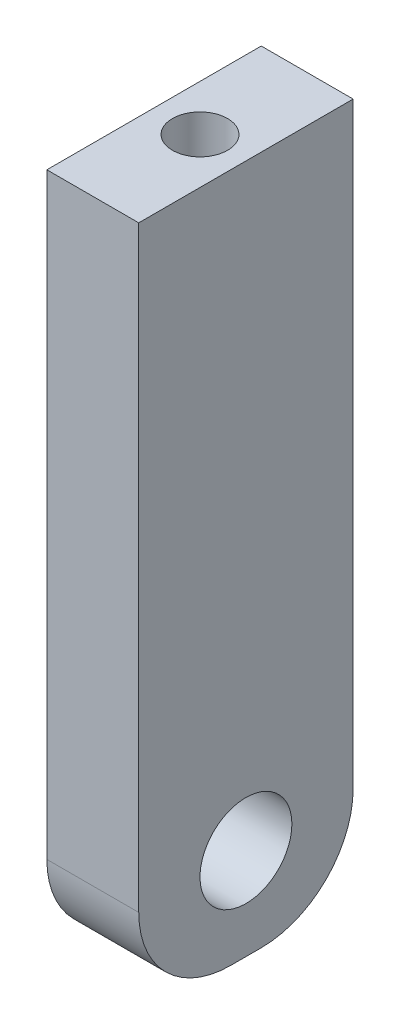
ISO-10303-21;
HEADER;
FILE_DESCRIPTION(('STEP AP214'),'2;1');
FILE_NAME('part.step','',(''),(''),'','','');
FILE_SCHEMA(('AUTOMOTIVE_DESIGN { 1 0 10303 214 1 1 1 1 }'));
ENDSEC;
DATA;
#1=APPLICATION_CONTEXT('core data for automotive mechanical design processes');
#2=APPLICATION_PROTOCOL_DEFINITION('international standard','automotive_design',2000,#1);
#3=PRODUCT_CONTEXT('',#1,'mechanical');
#4=PRODUCT('Part','Part','',(#3));
#5=PRODUCT_RELATED_PRODUCT_CATEGORY('part','',(#4));
#6=PRODUCT_DEFINITION_FORMATION('','',#4);
#7=PRODUCT_DEFINITION_CONTEXT('part definition',#1,'design');
#8=PRODUCT_DEFINITION('design','',#6,#7);
#9=PRODUCT_DEFINITION_SHAPE('','',#8);
#10=(LENGTH_UNIT() NAMED_UNIT(*) SI_UNIT(.MILLI.,.METRE.));
#11=(NAMED_UNIT(*) PLANE_ANGLE_UNIT() SI_UNIT($,.RADIAN.));
#12=(NAMED_UNIT(*) SI_UNIT($,.STERADIAN.) SOLID_ANGLE_UNIT());
#13=UNCERTAINTY_MEASURE_WITH_UNIT(LENGTH_MEASURE(1.E-05),#10,'distance_accuracy_value','');
#14=(GEOMETRIC_REPRESENTATION_CONTEXT(3) GLOBAL_UNCERTAINTY_ASSIGNED_CONTEXT((#13)) GLOBAL_UNIT_ASSIGNED_CONTEXT((#10,
#11,#12)) REPRESENTATION_CONTEXT('',''));
#15=CARTESIAN_POINT('',(0.,0.,0.));
#16=DIRECTION('',(0.,0.,1.));
#17=DIRECTION('',(1.,0.,0.));
#18=AXIS2_PLACEMENT_3D('',#15,#16,#17);
#19=CARTESIAN_POINT('',(3.,0.546254549383258,7.));
#20=DIRECTION('',(0.,-1.,0.));
#21=DIRECTION('',(1.,0.,0.));
#22=AXIS2_PLACEMENT_3D('',#19,#20,#21);
#23=PLANE('',#22);
#24=CARTESIAN_POINT('',(1.5,0.546254549383257,3.5));
#25=DIRECTION('',(0.,1.,0.));
#26=DIRECTION('',(-1.,0.,0.));
#27=AXIS2_PLACEMENT_3D('',#24,#25,#26);
#28=CIRCLE('',#27,0.9);
#29=CARTESIAN_POINT('',(0.6,0.546254549383257,3.5));
#30=VERTEX_POINT('',#29);
#31=EDGE_CURVE('E193',#30,#30,#28,.T.);
#32=ORIENTED_EDGE('',*,*,#31,.F.);
#33=EDGE_LOOP('',(#32));
#34=FACE_BOUND('',#33,.T.);
#35=DIRECTION('',(-1.,0.,0.));
#36=VECTOR('',#35,1.);
#37=CARTESIAN_POINT('',(3.,0.546254549383258,0.));
#38=LINE('',#37,#36);
#39=CARTESIAN_POINT('',(3.,0.546254549383258,0.));
#40=VERTEX_POINT('',#39);
#41=CARTESIAN_POINT('',(0.,0.546254549383257,0.));
#42=VERTEX_POINT('',#41);
#43=EDGE_CURVE('E115',#40,#42,#38,.T.);
#44=ORIENTED_EDGE('',*,*,#43,.T.);
#45=DIRECTION('',(0.,0.,-1.));
#46=VECTOR('',#45,1.);
#47=CARTESIAN_POINT('',(0.,0.546254549383257,7.));
#48=LINE('',#47,#46);
#49=CARTESIAN_POINT('',(0.,0.546254549383257,7.));
#50=VERTEX_POINT('',#49);
#51=EDGE_CURVE('E97',#50,#42,#48,.T.);
#52=ORIENTED_EDGE('',*,*,#51,.F.);
#53=DIRECTION('',(-1.,0.,0.));
#54=VECTOR('',#53,1.);
#55=CARTESIAN_POINT('',(3.,0.546254549383258,7.));
#56=LINE('',#55,#54);
#57=CARTESIAN_POINT('',(3.,0.546254549383258,7.));
#58=VERTEX_POINT('',#57);
#59=EDGE_CURVE('E104',#58,#50,#56,.T.);
#60=ORIENTED_EDGE('',*,*,#59,.F.);
#61=DIRECTION('',(0.,0.,-1.));
#62=VECTOR('',#61,1.);
#63=CARTESIAN_POINT('',(3.,0.546254549383258,7.));
#64=LINE('',#63,#62);
#65=EDGE_CURVE('E143',#58,#40,#64,.T.);
#66=ORIENTED_EDGE('',*,*,#65,.T.);
#67=EDGE_LOOP('',(#44,#52,#60,#66));
#68=FACE_BOUND('',#67,.T.);
#69=ADVANCED_FACE('F41',(#34,#68),#23,.F.);
#70=CARTESIAN_POINT('',(0.,0.546254549383257,7.));
#71=DIRECTION('',(1.,0.,0.));
#72=DIRECTION('',(0.,1.,0.));
#73=AXIS2_PLACEMENT_3D('',#70,#71,#72);
#74=PLANE('',#73);
#75=CARTESIAN_POINT('',(0.,-18.9537454506167,3.5));
#76=DIRECTION('',(1.,0.,0.));
#77=DIRECTION('',(0.,0.,-1.));
#78=AXIS2_PLACEMENT_3D('',#75,#76,#77);
#79=CIRCLE('',#78,1.5);
#80=CARTESIAN_POINT('',(0.,-18.9537454506167,2.));
#81=VERTEX_POINT('',#80);
#82=EDGE_CURVE('E149',#81,#81,#79,.T.);
#83=ORIENTED_EDGE('',*,*,#82,.T.);
#84=EDGE_LOOP('',(#83));
#85=FACE_BOUND('',#84,.T.);
#86=DIRECTION('',(0.,0.,-1.));
#87=VECTOR('',#86,1.);
#88=CARTESIAN_POINT('',(0.,-21.9537454506167,7.));
#89=LINE('',#88,#87);
#90=CARTESIAN_POINT('',(0.,-21.9537454506167,4.));
#91=VERTEX_POINT('',#90);
#92=CARTESIAN_POINT('',(0.,-21.9537454506167,3.));
#93=VERTEX_POINT('',#92);
#94=EDGE_CURVE('E117',#91,#93,#89,.T.);
#95=ORIENTED_EDGE('',*,*,#94,.F.);
#96=CARTESIAN_POINT('',(0.,-18.9537454506167,4.));
#97=DIRECTION('',(1.,0.,0.));
#98=DIRECTION('',(0.,1.,0.));
#99=AXIS2_PLACEMENT_3D('',#96,#97,#98);
#100=CIRCLE('',#99,3.);
#101=CARTESIAN_POINT('',(0.,-18.9537454506167,7.));
#102=VERTEX_POINT('',#101);
#103=EDGE_CURVE('E49',#91,#102,#100,.F.);
#104=ORIENTED_EDGE('',*,*,#103,.T.);
#105=DIRECTION('',(0.,-1.,0.));
#106=VECTOR('',#105,1.);
#107=CARTESIAN_POINT('',(0.,0.546254549383257,7.));
#108=LINE('',#107,#106);
#109=EDGE_CURVE('E93',#50,#102,#108,.T.);
#110=ORIENTED_EDGE('',*,*,#109,.F.);
#111=ORIENTED_EDGE('',*,*,#51,.T.);
#112=DIRECTION('',(0.,-1.,0.));
#113=VECTOR('',#112,1.);
#114=CARTESIAN_POINT('',(0.,0.546254549383257,0.));
#115=LINE('',#114,#113);
#116=CARTESIAN_POINT('',(0.,-18.9537454506167,0.));
#117=VERTEX_POINT('',#116);
#118=EDGE_CURVE('E148',#42,#117,#115,.T.);
#119=ORIENTED_EDGE('',*,*,#118,.T.);
#120=CARTESIAN_POINT('',(0.,-18.9537454506167,3.));
#121=DIRECTION('',(1.,0.,0.));
#122=DIRECTION('',(0.,1.,0.));
#123=AXIS2_PLACEMENT_3D('',#120,#121,#122);
#124=CIRCLE('',#123,3.);
#125=EDGE_CURVE('E61',#117,#93,#124,.F.);
#126=ORIENTED_EDGE('',*,*,#125,.T.);
#127=EDGE_LOOP('',(#95,#104,#110,#111,#119,#126));
#128=FACE_BOUND('',#127,.T.);
#129=ADVANCED_FACE('F95',(#85,#128),#74,.F.);
#130=CARTESIAN_POINT('',(0.,-21.9537454506167,7.));
#131=DIRECTION('',(0.,1.,0.));
#132=DIRECTION('',(0.,0.,1.));
#133=AXIS2_PLACEMENT_3D('',#130,#131,#132);
#134=PLANE('',#133);
#135=DIRECTION('',(0.,0.,-1.));
#136=VECTOR('',#135,1.);
#137=CARTESIAN_POINT('',(3.,-21.9537454506167,7.));
#138=LINE('',#137,#136);
#139=CARTESIAN_POINT('',(3.,-21.9537454506167,4.));
#140=VERTEX_POINT('',#139);
#141=CARTESIAN_POINT('',(3.,-21.9537454506167,3.));
#142=VERTEX_POINT('',#141);
#143=EDGE_CURVE('E121',#140,#142,#138,.T.);
#144=ORIENTED_EDGE('',*,*,#143,.F.);
#145=DIRECTION('',(1.,0.,0.));
#146=VECTOR('',#145,1.);
#147=CARTESIAN_POINT('',(0.,-21.9537454506167,4.));
#148=LINE('',#147,#146);
#149=EDGE_CURVE('E131',#140,#91,#148,.F.);
#150=ORIENTED_EDGE('',*,*,#149,.T.);
#151=ORIENTED_EDGE('',*,*,#94,.T.);
#152=DIRECTION('',(1.,0.,0.));
#153=VECTOR('',#152,1.);
#154=CARTESIAN_POINT('',(0.,-21.9537454506167,3.));
#155=LINE('',#154,#153);
#156=EDGE_CURVE('E128',#93,#142,#155,.T.);
#157=ORIENTED_EDGE('',*,*,#156,.T.);
#158=EDGE_LOOP('',(#144,#150,#151,#157));
#159=FACE_BOUND('',#158,.T.);
#160=ADVANCED_FACE('F136',(#159),#134,.F.);
#161=CARTESIAN_POINT('',(3.,-21.9537454506167,7.));
#162=DIRECTION('',(-1.,0.,0.));
#163=DIRECTION('',(0.,0.,1.));
#164=AXIS2_PLACEMENT_3D('',#161,#162,#163);
#165=PLANE('',#164);
#166=CARTESIAN_POINT('',(3.,-18.9537454506167,3.5));
#167=DIRECTION('',(1.,0.,0.));
#168=DIRECTION('',(0.,0.,-1.));
#169=AXIS2_PLACEMENT_3D('',#166,#167,#168);
#170=CIRCLE('',#169,1.5);
#171=CARTESIAN_POINT('',(3.,-18.9537454506167,2.));
#172=VERTEX_POINT('',#171);
#173=EDGE_CURVE('E192',#172,#172,#170,.T.);
#174=ORIENTED_EDGE('',*,*,#173,.F.);
#175=EDGE_LOOP('',(#174));
#176=FACE_BOUND('',#175,.T.);
#177=DIRECTION('',(0.,1.,0.));
#178=VECTOR('',#177,1.);
#179=CARTESIAN_POINT('',(3.,-21.9537454506167,7.));
#180=LINE('',#179,#178);
#181=CARTESIAN_POINT('',(3.,-18.9537454506167,7.));
#182=VERTEX_POINT('',#181);
#183=EDGE_CURVE('E103',#182,#58,#180,.T.);
#184=ORIENTED_EDGE('',*,*,#183,.F.);
#185=CARTESIAN_POINT('',(3.,-18.9537454506167,4.));
#186=DIRECTION('',(-1.,0.,0.));
#187=DIRECTION('',(0.,0.,1.));
#188=AXIS2_PLACEMENT_3D('',#185,#186,#187);
#189=CIRCLE('',#188,3.);
#190=EDGE_CURVE('E126',#182,#140,#189,.F.);
#191=ORIENTED_EDGE('',*,*,#190,.T.);
#192=ORIENTED_EDGE('',*,*,#143,.T.);
#193=CARTESIAN_POINT('',(3.,-18.9537454506167,3.));
#194=DIRECTION('',(-1.,0.,0.));
#195=DIRECTION('',(0.,0.,1.));
#196=AXIS2_PLACEMENT_3D('',#193,#194,#195);
#197=CIRCLE('',#196,3.);
#198=CARTESIAN_POINT('',(3.,-18.9537454506167,0.));
#199=VERTEX_POINT('',#198);
#200=EDGE_CURVE('E119',#142,#199,#197,.F.);
#201=ORIENTED_EDGE('',*,*,#200,.T.);
#202=DIRECTION('',(0.,1.,0.));
#203=VECTOR('',#202,1.);
#204=CARTESIAN_POINT('',(3.,-21.9537454506167,0.));
#205=LINE('',#204,#203);
#206=EDGE_CURVE('E112',#199,#40,#205,.T.);
#207=ORIENTED_EDGE('',*,*,#206,.T.);
#208=ORIENTED_EDGE('',*,*,#65,.F.);
#209=EDGE_LOOP('',(#184,#191,#192,#201,#207,#208));
#210=FACE_BOUND('',#209,.T.);
#211=ADVANCED_FACE('F142',(#176,#210),#165,.F.);
#212=CARTESIAN_POINT('',(0.,0.,7.));
#213=DIRECTION('',(0.,0.,1.));
#214=DIRECTION('',(1.,0.,0.));
#215=AXIS2_PLACEMENT_3D('',#212,#213,#214);
#216=PLANE('',#215);
#217=ORIENTED_EDGE('',*,*,#109,.T.);
#218=DIRECTION('',(1.,0.,0.));
#219=VECTOR('',#218,1.);
#220=CARTESIAN_POINT('',(3.,-18.9537454506167,7.));
#221=LINE('',#220,#219);
#222=EDGE_CURVE('E116',#102,#182,#221,.T.);
#223=ORIENTED_EDGE('',*,*,#222,.T.);
#224=ORIENTED_EDGE('',*,*,#183,.T.);
#225=ORIENTED_EDGE('',*,*,#59,.T.);
#226=EDGE_LOOP('',(#217,#223,#224,#225));
#227=FACE_BOUND('',#226,.T.);
#228=ADVANCED_FACE('F107',(#227),#216,.T.);
#229=CARTESIAN_POINT('',(0.,0.,0.));
#230=DIRECTION('',(0.,0.,1.));
#231=DIRECTION('',(1.,0.,0.));
#232=AXIS2_PLACEMENT_3D('',#229,#230,#231);
#233=PLANE('',#232);
#234=ORIENTED_EDGE('',*,*,#206,.F.);
#235=DIRECTION('',(1.,0.,0.));
#236=VECTOR('',#235,1.);
#237=CARTESIAN_POINT('',(0.,-18.9537454506167,0.));
#238=LINE('',#237,#236);
#239=EDGE_CURVE('E11',#199,#117,#238,.F.);
#240=ORIENTED_EDGE('',*,*,#239,.T.);
#241=ORIENTED_EDGE('',*,*,#118,.F.);
#242=ORIENTED_EDGE('',*,*,#43,.F.);
#243=EDGE_LOOP('',(#234,#240,#241,#242));
#244=FACE_BOUND('',#243,.T.);
#245=ADVANCED_FACE('F152',(#244),#233,.F.);
#246=CARTESIAN_POINT('',(0.,-18.9537454506167,3.5));
#247=DIRECTION('',(1.,0.,0.));
#248=DIRECTION('',(0.,0.,-1.));
#249=AXIS2_PLACEMENT_3D('',#246,#247,#248);
#250=CYLINDRICAL_SURFACE('',#249,1.5);
#251=CARTESIAN_POINT('',(0.,-18.9537454506167,2.));
#252=CARTESIAN_POINT('',(0.0312499999999995,-18.9537454506167,2.));
#253=CARTESIAN_POINT('',(0.0624999999999996,-18.9537454506167,2.));
#254=CARTESIAN_POINT('',(0.125,-18.9537454506167,2.));
#255=CARTESIAN_POINT('',(0.15625,-18.9537454506167,2.));
#256=CARTESIAN_POINT('',(0.21875,-18.9537454506167,2.));
#257=CARTESIAN_POINT('',(0.25,-18.9537454506167,2.));
#258=CARTESIAN_POINT('',(0.3125,-18.9537454506167,2.));
#259=CARTESIAN_POINT('',(0.34375,-18.9537454506167,2.));
#260=CARTESIAN_POINT('',(0.40625,-18.9537454506167,2.));
#261=CARTESIAN_POINT('',(0.4375,-18.9537454506167,2.));
#262=CARTESIAN_POINT('',(0.5,-18.9537454506167,2.));
#263=CARTESIAN_POINT('',(0.53125,-18.9537454506167,2.));
#264=CARTESIAN_POINT('',(0.59375,-18.9537454506167,2.));
#265=CARTESIAN_POINT('',(0.625,-18.9537454506167,2.));
#266=CARTESIAN_POINT('',(0.6875,-18.9537454506167,2.));
#267=CARTESIAN_POINT('',(0.71875,-18.9537454506167,2.));
#268=CARTESIAN_POINT('',(0.78125,-18.9537454506167,2.));
#269=CARTESIAN_POINT('',(0.8125,-18.9537454506167,2.));
#270=CARTESIAN_POINT('',(0.875,-18.9537454506167,2.));
#271=CARTESIAN_POINT('',(0.90625,-18.9537454506167,2.));
#272=CARTESIAN_POINT('',(0.96875,-18.9537454506167,2.));
#273=CARTESIAN_POINT('',(1.,-18.9537454506167,2.));
#274=CARTESIAN_POINT('',(1.0625,-18.9537454506167,2.));
#275=CARTESIAN_POINT('',(1.09375,-18.9537454506167,2.));
#276=CARTESIAN_POINT('',(1.15625,-18.9537454506167,2.));
#277=CARTESIAN_POINT('',(1.1875,-18.9537454506167,2.));
#278=CARTESIAN_POINT('',(1.25,-18.9537454506167,2.));
#279=CARTESIAN_POINT('',(1.28125,-18.9537454506167,2.));
#280=CARTESIAN_POINT('',(1.34375,-18.9537454506167,2.));
#281=CARTESIAN_POINT('',(1.375,-18.9537454506167,2.));
#282=CARTESIAN_POINT('',(1.4375,-18.9537454506167,2.));
#283=CARTESIAN_POINT('',(1.46875,-18.9537454506167,2.));
#284=CARTESIAN_POINT('',(1.53125,-18.9537454506167,2.));
#285=CARTESIAN_POINT('',(1.5625,-18.9537454506167,2.));
#286=CARTESIAN_POINT('',(1.625,-18.9537454506167,2.));
#287=CARTESIAN_POINT('',(1.65625,-18.9537454506167,2.));
#288=CARTESIAN_POINT('',(1.71875,-18.9537454506167,2.));
#289=CARTESIAN_POINT('',(1.75,-18.9537454506167,2.));
#290=CARTESIAN_POINT('',(1.8125,-18.9537454506167,2.));
#291=CARTESIAN_POINT('',(1.84375,-18.9537454506167,2.));
#292=CARTESIAN_POINT('',(1.90625,-18.9537454506167,2.));
#293=CARTESIAN_POINT('',(1.9375,-18.9537454506167,2.));
#294=CARTESIAN_POINT('',(2.,-18.9537454506167,2.));
#295=CARTESIAN_POINT('',(2.03125,-18.9537454506167,2.));
#296=CARTESIAN_POINT('',(2.09375,-18.9537454506167,2.));
#297=CARTESIAN_POINT('',(2.125,-18.9537454506167,2.));
#298=CARTESIAN_POINT('',(2.1875,-18.9537454506167,2.));
#299=CARTESIAN_POINT('',(2.21875,-18.9537454506167,2.));
#300=CARTESIAN_POINT('',(2.28125,-18.9537454506167,2.));
#301=CARTESIAN_POINT('',(2.3125,-18.9537454506167,2.));
#302=CARTESIAN_POINT('',(2.375,-18.9537454506167,2.));
#303=CARTESIAN_POINT('',(2.40625,-18.9537454506167,2.));
#304=CARTESIAN_POINT('',(2.46875,-18.9537454506167,2.));
#305=CARTESIAN_POINT('',(2.5,-18.9537454506167,2.));
#306=CARTESIAN_POINT('',(2.5625,-18.9537454506167,2.));
#307=CARTESIAN_POINT('',(2.59375,-18.9537454506167,2.));
#308=CARTESIAN_POINT('',(2.65625,-18.9537454506167,2.));
#309=CARTESIAN_POINT('',(2.6875,-18.9537454506167,2.));
#310=CARTESIAN_POINT('',(2.75,-18.9537454506167,2.));
#311=CARTESIAN_POINT('',(2.78125,-18.9537454506167,2.));
#312=CARTESIAN_POINT('',(2.84375,-18.9537454506167,2.));
#313=CARTESIAN_POINT('',(2.875,-18.9537454506167,2.));
#314=CARTESIAN_POINT('',(2.9375,-18.9537454506167,2.));
#315=CARTESIAN_POINT('',(2.96875,-18.9537454506167,2.));
#316=CARTESIAN_POINT('',(3.,-18.9537454506167,2.));
#317=B_SPLINE_CURVE_WITH_KNOTS('',3,(#251,#252,#253,#254,#255,#256,#257,#258,#259,#260,#261,
#262,#263,#264,#265,#266,#267,#268,#269,#270,#271,#272,#273,#274,#275,#276,#277,#278,#279,#280,
#281,#282,#283,#284,#285,#286,#287,#288,#289,#290,#291,#292,#293,#294,#295,#296,#297,#298,#299,
#300,#301,#302,#303,#304,#305,#306,#307,#308,#309,#310,#311,#312,#313,#314,#315,#316),
.UNSPECIFIED.,.F.,.F.,(4,2,2,2,2,2,2,2,2,2,2,2,2,2,2,2,2,2,2,2,2,2,2,2,2,2,2,2,2,2,2,2,4),(0.,
0.09375,0.1875,0.28125,0.375,0.46875,0.5625,0.65625,0.75,0.84375,0.9375,1.03125,1.125,1.21875,
1.3125,1.40625,1.5,1.59375,1.6875,1.78125,1.875,1.96875,2.0625,2.15625,2.25,2.34375,2.4375,
2.53125,2.625,2.71875,2.8125,2.90625,3.),.UNSPECIFIED.);
#318=EDGE_CURVE('BSEAM163',#81,#172,#317,.T.);
#319=ORIENTED_EDGE('',*,*,#82,.F.);
#320=ORIENTED_EDGE('',*,*,#173,.T.);
#321=ORIENTED_EDGE('',*,*,#318,.T.);
#322=ORIENTED_EDGE('',*,*,#318,.F.);
#323=EDGE_LOOP('',(#319,#321,#320,#322));
#324=FACE_BOUND('',#323,.T.);
#325=ADVANCED_FACE('F163',(#324),#250,.F.);
#326=CARTESIAN_POINT('',(0.,-18.9537454506167,4.));
#327=DIRECTION('',(-1.,0.,0.));
#328=DIRECTION('',(0.,0.,1.));
#329=AXIS2_PLACEMENT_3D('',#326,#327,#328);
#330=CYLINDRICAL_SURFACE('',#329,3.);
#331=ORIENTED_EDGE('',*,*,#103,.F.);
#332=ORIENTED_EDGE('',*,*,#149,.F.);
#333=ORIENTED_EDGE('',*,*,#190,.F.);
#334=ORIENTED_EDGE('',*,*,#222,.F.);
#335=EDGE_LOOP('',(#331,#332,#333,#334));
#336=FACE_BOUND('',#335,.T.);
#337=ADVANCED_FACE('F140',(#336),#330,.T.);
#338=CARTESIAN_POINT('',(0.,-18.9537454506167,3.));
#339=DIRECTION('',(1.,0.,0.));
#340=DIRECTION('',(0.,0.,-1.));
#341=AXIS2_PLACEMENT_3D('',#338,#339,#340);
#342=CYLINDRICAL_SURFACE('',#341,3.);
#343=ORIENTED_EDGE('',*,*,#125,.F.);
#344=ORIENTED_EDGE('',*,*,#239,.F.);
#345=ORIENTED_EDGE('',*,*,#200,.F.);
#346=ORIENTED_EDGE('',*,*,#156,.F.);
#347=EDGE_LOOP('',(#343,#344,#345,#346));
#348=FACE_BOUND('',#347,.T.);
#349=ADVANCED_FACE('F43',(#348),#342,.T.);
#350=CARTESIAN_POINT('',(1.5,-6.45374545061674,3.5));
#351=DIRECTION('',(0.,1.,0.));
#352=DIRECTION('',(-1.,0.,0.));
#353=AXIS2_PLACEMENT_3D('',#350,#351,#352);
#354=CYLINDRICAL_SURFACE('',#353,0.9);
#355=CARTESIAN_POINT('',(1.5,-6.45374545061674,3.5));
#356=DIRECTION('',(0.,1.,0.));
#357=DIRECTION('',(-1.,0.,0.));
#358=AXIS2_PLACEMENT_3D('',#355,#356,#357);
#359=CIRCLE('',#358,0.9);
#360=CARTESIAN_POINT('',(0.600000000000001,-6.45374545061674,3.5));
#361=VERTEX_POINT('',#360);
#362=EDGE_CURVE('E191',#361,#361,#359,.T.);
#363=ORIENTED_EDGE('',*,*,#362,.F.);
#364=EDGE_LOOP('',(#363));
#365=FACE_BOUND('',#364,.T.);
#366=ORIENTED_EDGE('',*,*,#31,.T.);
#367=EDGE_LOOP('',(#366));
#368=FACE_BOUND('',#367,.T.);
#369=ADVANCED_FACE('F154',(#365,#368),#354,.F.);
#370=CARTESIAN_POINT('',(1.5,-6.45374545061674,3.5));
#371=DIRECTION('',(0.,1.,0.));
#372=DIRECTION('',(-1.,0.,0.));
#373=AXIS2_PLACEMENT_3D('',#370,#371,#372);
#374=PLANE('',#373);
#375=ORIENTED_EDGE('',*,*,#362,.T.);
#376=EDGE_LOOP('',(#375));
#377=FACE_BOUND('',#376,.T.);
#378=ADVANCED_FACE('F160',(#377),#374,.T.);
#379=CLOSED_SHELL('',(#69,#129,#160,#211,#228,#245,#325,#337,#349,#369,#378));
#380=MANIFOLD_SOLID_BREP('B2',#379);
#381=ADVANCED_BREP_SHAPE_REPRESENTATION('',(#18,#380),#14);
#382=SHAPE_DEFINITION_REPRESENTATION(#9,#381);
ENDSEC;
END-ISO-10303-21;
